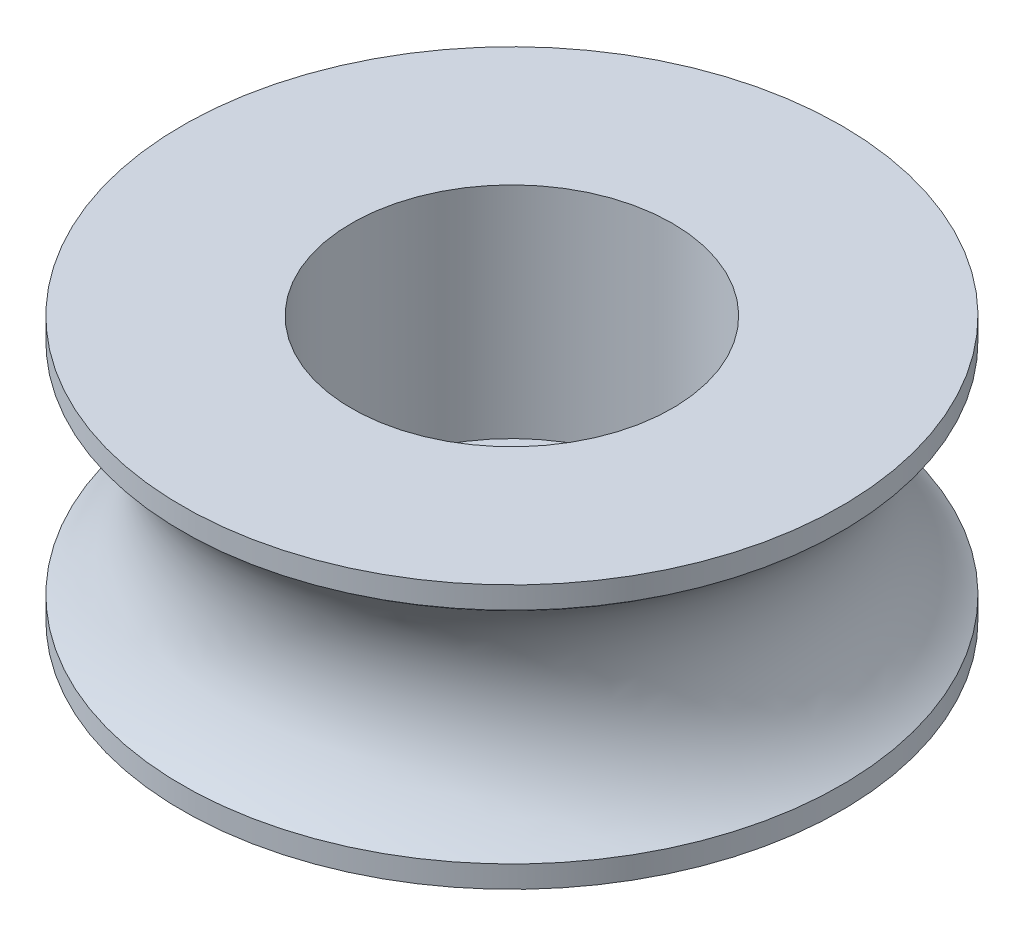
ISO-10303-21;
HEADER;
FILE_DESCRIPTION(('STEP AP214'),'2;1');
FILE_NAME('part.step','',(''),(''),'','','');
FILE_SCHEMA(('AUTOMOTIVE_DESIGN { 1 0 10303 214 1 1 1 1 }'));
ENDSEC;
DATA;
#1=APPLICATION_CONTEXT('core data for automotive mechanical design processes');
#2=APPLICATION_PROTOCOL_DEFINITION('international standard','automotive_design',2000,#1);
#3=PRODUCT_CONTEXT('',#1,'mechanical');
#4=PRODUCT('Part','Part','',(#3));
#5=PRODUCT_RELATED_PRODUCT_CATEGORY('part','',(#4));
#6=PRODUCT_DEFINITION_FORMATION('','',#4);
#7=PRODUCT_DEFINITION_CONTEXT('part definition',#1,'design');
#8=PRODUCT_DEFINITION('design','',#6,#7);
#9=PRODUCT_DEFINITION_SHAPE('','',#8);
#10=(LENGTH_UNIT() NAMED_UNIT(*) SI_UNIT(.MILLI.,.METRE.));
#11=(NAMED_UNIT(*) PLANE_ANGLE_UNIT() SI_UNIT($,.RADIAN.));
#12=(NAMED_UNIT(*) SI_UNIT($,.STERADIAN.) SOLID_ANGLE_UNIT());
#13=UNCERTAINTY_MEASURE_WITH_UNIT(LENGTH_MEASURE(1.E-05),#10,'distance_accuracy_value','');
#14=(GEOMETRIC_REPRESENTATION_CONTEXT(3) GLOBAL_UNCERTAINTY_ASSIGNED_CONTEXT((#13)) GLOBAL_UNIT_ASSIGNED_CONTEXT((#10,
#11,#12)) REPRESENTATION_CONTEXT('',''));
#15=CARTESIAN_POINT('',(0.,0.,0.));
#16=DIRECTION('',(0.,0.,1.));
#17=DIRECTION('',(1.,0.,0.));
#18=AXIS2_PLACEMENT_3D('',#15,#16,#17);
#19=CARTESIAN_POINT('',(0.,-6.62953088122321,0.));
#20=DIRECTION('',(0.,-1.,0.));
#21=DIRECTION('',(0.,0.,-1.));
#22=AXIS2_PLACEMENT_3D('',#19,#20,#21);
#23=CYLINDRICAL_SURFACE('',#22,2.5);
#24=CARTESIAN_POINT('',(0.,1.,0.));
#25=DIRECTION('',(0.,-1.,0.));
#26=DIRECTION('',(0.,0.,-1.));
#27=AXIS2_PLACEMENT_3D('',#24,#25,#26);
#28=CIRCLE('',#27,2.5);
#29=CARTESIAN_POINT('',(0.,1.,-2.5));
#30=VERTEX_POINT('',#29);
#31=EDGE_CURVE('E10',#30,#30,#28,.T.);
#32=ORIENTED_EDGE('',*,*,#31,.F.);
#33=EDGE_LOOP('',(#32));
#34=FACE_BOUND('',#33,.T.);
#35=CARTESIAN_POINT('',(0.,0.,0.));
#36=DIRECTION('',(0.,-1.,0.));
#37=DIRECTION('',(0.,0.,-1.));
#38=AXIS2_PLACEMENT_3D('',#35,#36,#37);
#39=CIRCLE('',#38,2.5);
#40=CARTESIAN_POINT('',(0.,0.,-2.5));
#41=VERTEX_POINT('',#40);
#42=EDGE_CURVE('E59',#41,#41,#39,.T.);
#43=ORIENTED_EDGE('',*,*,#42,.T.);
#44=EDGE_LOOP('',(#43));
#45=FACE_BOUND('',#44,.T.);
#46=ADVANCED_FACE('F31',(#34,#45),#23,.F.);
#47=CARTESIAN_POINT('',(-3.65,1.,0.));
#48=DIRECTION('',(0.,-1.,0.));
#49=DIRECTION('',(0.,0.,-1.));
#50=AXIS2_PLACEMENT_3D('',#47,#48,#49);
#51=PLANE('',#50);
#52=CARTESIAN_POINT('',(0.,1.,0.));
#53=DIRECTION('',(0.,-1.,0.));
#54=DIRECTION('',(0.,0.,-1.));
#55=AXIS2_PLACEMENT_3D('',#52,#53,#54);
#56=CIRCLE('',#55,3.65);
#57=CARTESIAN_POINT('',(0.,1.,-3.65));
#58=VERTEX_POINT('',#57);
#59=EDGE_CURVE('E37',#58,#58,#56,.T.);
#60=ORIENTED_EDGE('',*,*,#59,.F.);
#61=EDGE_LOOP('',(#60));
#62=FACE_BOUND('',#61,.T.);
#63=ORIENTED_EDGE('',*,*,#31,.T.);
#64=EDGE_LOOP('',(#63));
#65=FACE_BOUND('',#64,.T.);
#66=ADVANCED_FACE('F96',(#62,#65),#51,.F.);
#67=CARTESIAN_POINT('',(0.,-6.62953088122321,0.));
#68=DIRECTION('',(0.,-1.,0.));
#69=DIRECTION('',(0.,0.,-1.));
#70=AXIS2_PLACEMENT_3D('',#67,#68,#69);
#71=CYLINDRICAL_SURFACE('',#70,3.65);
#72=CARTESIAN_POINT('',(0.,6.,0.));
#73=DIRECTION('',(0.,-1.,0.));
#74=DIRECTION('',(0.,0.,-1.));
#75=AXIS2_PLACEMENT_3D('',#72,#73,#74);
#76=CIRCLE('',#75,3.65);
#77=CARTESIAN_POINT('',(0.,6.,-3.65));
#78=VERTEX_POINT('',#77);
#79=EDGE_CURVE('E41',#78,#78,#76,.T.);
#80=ORIENTED_EDGE('',*,*,#79,.F.);
#81=EDGE_LOOP('',(#80));
#82=FACE_BOUND('',#81,.T.);
#83=ORIENTED_EDGE('',*,*,#59,.T.);
#84=EDGE_LOOP('',(#83));
#85=FACE_BOUND('',#84,.T.);
#86=ADVANCED_FACE('F91',(#82,#85),#71,.F.);
#87=CARTESIAN_POINT('',(-7.5,6.,0.));
#88=DIRECTION('',(0.,-1.,0.));
#89=DIRECTION('',(0.,0.,-1.));
#90=AXIS2_PLACEMENT_3D('',#87,#88,#89);
#91=PLANE('',#90);
#92=CARTESIAN_POINT('',(0.,6.,0.));
#93=DIRECTION('',(0.,-1.,0.));
#94=DIRECTION('',(0.,0.,-1.));
#95=AXIS2_PLACEMENT_3D('',#92,#93,#94);
#96=CIRCLE('',#95,7.5);
#97=CARTESIAN_POINT('',(0.,6.,-7.5));
#98=VERTEX_POINT('',#97);
#99=EDGE_CURVE('E45',#98,#98,#96,.T.);
#100=ORIENTED_EDGE('',*,*,#99,.F.);
#101=EDGE_LOOP('',(#100));
#102=FACE_BOUND('',#101,.T.);
#103=ORIENTED_EDGE('',*,*,#79,.T.);
#104=EDGE_LOOP('',(#103));
#105=FACE_BOUND('',#104,.T.);
#106=ADVANCED_FACE('F85',(#102,#105),#91,.F.);
#107=CARTESIAN_POINT('',(0.,-6.62953088122321,0.));
#108=DIRECTION('',(0.,-1.,0.));
#109=DIRECTION('',(0.,0.,-1.));
#110=AXIS2_PLACEMENT_3D('',#107,#108,#109);
#111=CYLINDRICAL_SURFACE('',#110,7.5);
#112=CARTESIAN_POINT('',(0.,5.5,0.));
#113=DIRECTION('',(0.,-1.,0.));
#114=DIRECTION('',(0.,0.,-1.));
#115=AXIS2_PLACEMENT_3D('',#112,#113,#114);
#116=CIRCLE('',#115,7.5);
#117=CARTESIAN_POINT('',(0.,5.5,-7.5));
#118=VERTEX_POINT('',#117);
#119=EDGE_CURVE('E50',#118,#118,#116,.T.);
#120=ORIENTED_EDGE('',*,*,#119,.F.);
#121=EDGE_LOOP('',(#120));
#122=FACE_BOUND('',#121,.T.);
#123=ORIENTED_EDGE('',*,*,#99,.T.);
#124=EDGE_LOOP('',(#123));
#125=FACE_BOUND('',#124,.T.);
#126=ADVANCED_FACE('F79',(#122,#125),#111,.T.);
#127=CARTESIAN_POINT('',(0.,3.,0.));
#128=DIRECTION('',(0.,-1.,0.));
#129=DIRECTION('',(0.,0.,-1.));
#130=AXIS2_PLACEMENT_3D('',#127,#128,#129);
#131=TOROIDAL_SURFACE('',#130,9.1583123951777,3.);
#132=CARTESIAN_POINT('',(0.,0.5,0.));
#133=DIRECTION('',(0.,-1.,0.));
#134=DIRECTION('',(0.,0.,-1.));
#135=AXIS2_PLACEMENT_3D('',#132,#133,#134);
#136=CIRCLE('',#135,7.5);
#137=CARTESIAN_POINT('',(0.,0.5,-7.5));
#138=VERTEX_POINT('',#137);
#139=EDGE_CURVE('E53',#138,#138,#136,.T.);
#140=ORIENTED_EDGE('',*,*,#139,.F.);
#141=EDGE_LOOP('',(#140));
#142=FACE_BOUND('',#141,.T.);
#143=ORIENTED_EDGE('',*,*,#119,.T.);
#144=EDGE_LOOP('',(#143));
#145=FACE_BOUND('',#144,.T.);
#146=ADVANCED_FACE('F73',(#142,#145),#131,.F.);
#147=CARTESIAN_POINT('',(0.,-6.62953088122321,0.));
#148=DIRECTION('',(0.,-1.,0.));
#149=DIRECTION('',(0.,0.,-1.));
#150=AXIS2_PLACEMENT_3D('',#147,#148,#149);
#151=CYLINDRICAL_SURFACE('',#150,7.5);
#152=CARTESIAN_POINT('',(0.,0.,0.));
#153=DIRECTION('',(0.,-1.,0.));
#154=DIRECTION('',(0.,0.,-1.));
#155=AXIS2_PLACEMENT_3D('',#152,#153,#154);
#156=CIRCLE('',#155,7.5);
#157=CARTESIAN_POINT('',(0.,0.,-7.5));
#158=VERTEX_POINT('',#157);
#159=EDGE_CURVE('E56',#158,#158,#156,.T.);
#160=ORIENTED_EDGE('',*,*,#159,.F.);
#161=EDGE_LOOP('',(#160));
#162=FACE_BOUND('',#161,.T.);
#163=ORIENTED_EDGE('',*,*,#139,.T.);
#164=EDGE_LOOP('',(#163));
#165=FACE_BOUND('',#164,.T.);
#166=ADVANCED_FACE('F67',(#162,#165),#151,.T.);
#167=CARTESIAN_POINT('',(-2.5,0.,0.));
#168=DIRECTION('',(0.,1.,0.));
#169=DIRECTION('',(0.,0.,1.));
#170=AXIS2_PLACEMENT_3D('',#167,#168,#169);
#171=PLANE('',#170);
#172=ORIENTED_EDGE('',*,*,#42,.F.);
#173=EDGE_LOOP('',(#172));
#174=FACE_BOUND('',#173,.T.);
#175=ORIENTED_EDGE('',*,*,#159,.T.);
#176=EDGE_LOOP('',(#175));
#177=FACE_BOUND('',#176,.T.);
#178=ADVANCED_FACE('F64',(#174,#177),#171,.F.);
#179=CLOSED_SHELL('',(#46,#66,#86,#106,#126,#146,#166,#178));
#180=MANIFOLD_SOLID_BREP('B2',#179);
#181=ADVANCED_BREP_SHAPE_REPRESENTATION('',(#18,#180),#14);
#182=SHAPE_DEFINITION_REPRESENTATION(#9,#181);
ENDSEC;
END-ISO-10303-21;
